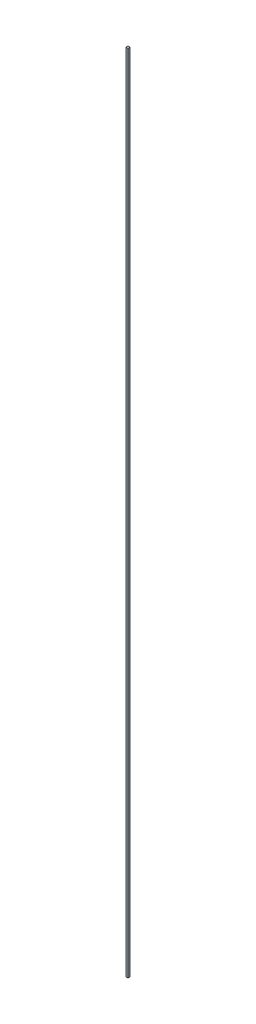
ISO-10303-21;
HEADER;
FILE_DESCRIPTION(('STEP AP214'),'2;1');
FILE_NAME('part.step','',(''),(''),'','','');
FILE_SCHEMA(('AUTOMOTIVE_DESIGN { 1 0 10303 214 1 1 1 1 }'));
ENDSEC;
DATA;
#1=APPLICATION_CONTEXT('core data for automotive mechanical design processes');
#2=APPLICATION_PROTOCOL_DEFINITION('international standard','automotive_design',2000,#1);
#3=PRODUCT_CONTEXT('',#1,'mechanical');
#4=PRODUCT('Part','Part','',(#3));
#5=PRODUCT_RELATED_PRODUCT_CATEGORY('part','',(#4));
#6=PRODUCT_DEFINITION_FORMATION('','',#4);
#7=PRODUCT_DEFINITION_CONTEXT('part definition',#1,'design');
#8=PRODUCT_DEFINITION('design','',#6,#7);
#9=PRODUCT_DEFINITION_SHAPE('','',#8);
#10=(LENGTH_UNIT() NAMED_UNIT(*) SI_UNIT(.MILLI.,.METRE.));
#11=(NAMED_UNIT(*) PLANE_ANGLE_UNIT() SI_UNIT($,.RADIAN.));
#12=(NAMED_UNIT(*) SI_UNIT($,.STERADIAN.) SOLID_ANGLE_UNIT());
#13=UNCERTAINTY_MEASURE_WITH_UNIT(LENGTH_MEASURE(1.E-05),#10,'distance_accuracy_value','');
#14=(GEOMETRIC_REPRESENTATION_CONTEXT(3) GLOBAL_UNCERTAINTY_ASSIGNED_CONTEXT((#13)) GLOBAL_UNIT_ASSIGNED_CONTEXT((#10,
#11,#12)) REPRESENTATION_CONTEXT('',''));
#15=CARTESIAN_POINT('',(0.,0.,0.));
#16=DIRECTION('',(0.,0.,1.));
#17=DIRECTION('',(1.,0.,0.));
#18=AXIS2_PLACEMENT_3D('',#15,#16,#17);
#19=CARTESIAN_POINT('',(1.5875,1219.2,1.5875));
#20=DIRECTION('',(-1.,0.,0.));
#21=DIRECTION('',(0.,0.,1.));
#22=AXIS2_PLACEMENT_3D('',#19,#20,#21);
#23=PLANE('',#22);
#24=DIRECTION('',(0.,0.,-1.));
#25=VECTOR('',#24,1.);
#26=CARTESIAN_POINT('',(1.5875,0.,1.5875));
#27=LINE('',#26,#25);
#28=CARTESIAN_POINT('',(1.5875,0.,1.5875));
#29=VERTEX_POINT('',#28);
#30=CARTESIAN_POINT('',(1.5875,0.,-1.5875));
#31=VERTEX_POINT('',#30);
#32=EDGE_CURVE('E81',#29,#31,#27,.T.);
#33=ORIENTED_EDGE('',*,*,#32,.T.);
#34=DIRECTION('',(0.,-1.,0.));
#35=VECTOR('',#34,1.);
#36=CARTESIAN_POINT('',(1.5875,1219.2,-1.5875));
#37=LINE('',#36,#35);
#38=CARTESIAN_POINT('',(1.5875,1219.2,-1.5875));
#39=VERTEX_POINT('',#38);
#40=EDGE_CURVE('E10',#39,#31,#37,.T.);
#41=ORIENTED_EDGE('',*,*,#40,.F.);
#42=DIRECTION('',(0.,0.,-1.));
#43=VECTOR('',#42,1.);
#44=CARTESIAN_POINT('',(1.5875,1219.2,1.5875));
#45=LINE('',#44,#43);
#46=CARTESIAN_POINT('',(1.5875,1219.2,1.5875));
#47=VERTEX_POINT('',#46);
#48=EDGE_CURVE('E67',#47,#39,#45,.T.);
#49=ORIENTED_EDGE('',*,*,#48,.F.);
#50=DIRECTION('',(0.,-1.,0.));
#51=VECTOR('',#50,1.);
#52=CARTESIAN_POINT('',(1.5875,1219.2,1.5875));
#53=LINE('',#52,#51);
#54=EDGE_CURVE('E75',#47,#29,#53,.T.);
#55=ORIENTED_EDGE('',*,*,#54,.T.);
#56=EDGE_LOOP('',(#33,#41,#49,#55));
#57=FACE_BOUND('',#56,.T.);
#58=ADVANCED_FACE('F16',(#57),#23,.F.);
#59=CARTESIAN_POINT('',(1.5875,1219.2,-1.5875));
#60=DIRECTION('',(0.,0.,1.));
#61=DIRECTION('',(1.,0.,0.));
#62=AXIS2_PLACEMENT_3D('',#59,#60,#61);
#63=PLANE('',#62);
#64=DIRECTION('',(-1.,0.,0.));
#65=VECTOR('',#64,1.);
#66=CARTESIAN_POINT('',(1.5875,0.,-1.5875));
#67=LINE('',#66,#65);
#68=CARTESIAN_POINT('',(-1.5875,0.,-1.5875));
#69=VERTEX_POINT('',#68);
#70=EDGE_CURVE('E71',#31,#69,#67,.T.);
#71=ORIENTED_EDGE('',*,*,#70,.T.);
#72=DIRECTION('',(0.,-1.,0.));
#73=VECTOR('',#72,1.);
#74=CARTESIAN_POINT('',(-1.5875,1219.2,-1.5875));
#75=LINE('',#74,#73);
#76=CARTESIAN_POINT('',(-1.5875,1219.2,-1.5875));
#77=VERTEX_POINT('',#76);
#78=EDGE_CURVE('E24',#77,#69,#75,.T.);
#79=ORIENTED_EDGE('',*,*,#78,.F.);
#80=DIRECTION('',(-1.,0.,0.));
#81=VECTOR('',#80,1.);
#82=CARTESIAN_POINT('',(1.5875,1219.2,-1.5875));
#83=LINE('',#82,#81);
#84=EDGE_CURVE('E62',#39,#77,#83,.T.);
#85=ORIENTED_EDGE('',*,*,#84,.F.);
#86=ORIENTED_EDGE('',*,*,#40,.T.);
#87=EDGE_LOOP('',(#71,#79,#85,#86));
#88=FACE_BOUND('',#87,.T.);
#89=ADVANCED_FACE('F70',(#88),#63,.F.);
#90=CARTESIAN_POINT('',(-1.5875,1219.2,-1.5875));
#91=DIRECTION('',(1.,0.,0.));
#92=DIRECTION('',(0.,0.,-1.));
#93=AXIS2_PLACEMENT_3D('',#90,#91,#92);
#94=PLANE('',#93);
#95=DIRECTION('',(0.,0.,1.));
#96=VECTOR('',#95,1.);
#97=CARTESIAN_POINT('',(-1.5875,0.,-1.5875));
#98=LINE('',#97,#96);
#99=CARTESIAN_POINT('',(-1.5875,0.,1.5875));
#100=VERTEX_POINT('',#99);
#101=EDGE_CURVE('E49',#69,#100,#98,.T.);
#102=ORIENTED_EDGE('',*,*,#101,.T.);
#103=DIRECTION('',(0.,-1.,0.));
#104=VECTOR('',#103,1.);
#105=CARTESIAN_POINT('',(-1.5875,1219.2,1.5875));
#106=LINE('',#105,#104);
#107=CARTESIAN_POINT('',(-1.5875,1219.2,1.5875));
#108=VERTEX_POINT('',#107);
#109=EDGE_CURVE('E72',#108,#100,#106,.T.);
#110=ORIENTED_EDGE('',*,*,#109,.F.);
#111=DIRECTION('',(0.,0.,1.));
#112=VECTOR('',#111,1.);
#113=CARTESIAN_POINT('',(-1.5875,1219.2,-1.5875));
#114=LINE('',#113,#112);
#115=EDGE_CURVE('E65',#77,#108,#114,.T.);
#116=ORIENTED_EDGE('',*,*,#115,.F.);
#117=ORIENTED_EDGE('',*,*,#78,.T.);
#118=EDGE_LOOP('',(#102,#110,#116,#117));
#119=FACE_BOUND('',#118,.T.);
#120=ADVANCED_FACE('F73',(#119),#94,.F.);
#121=CARTESIAN_POINT('',(-1.5875,1219.2,1.5875));
#122=DIRECTION('',(0.,0.,-1.));
#123=DIRECTION('',(-1.,0.,0.));
#124=AXIS2_PLACEMENT_3D('',#121,#122,#123);
#125=PLANE('',#124);
#126=DIRECTION('',(1.,0.,0.));
#127=VECTOR('',#126,1.);
#128=CARTESIAN_POINT('',(-1.5875,0.,1.5875));
#129=LINE('',#128,#127);
#130=EDGE_CURVE('E55',#100,#29,#129,.T.);
#131=ORIENTED_EDGE('',*,*,#130,.T.);
#132=ORIENTED_EDGE('',*,*,#54,.F.);
#133=DIRECTION('',(1.,0.,0.));
#134=VECTOR('',#133,1.);
#135=CARTESIAN_POINT('',(-1.5875,1219.2,1.5875));
#136=LINE('',#135,#134);
#137=EDGE_CURVE('E32',#108,#47,#136,.T.);
#138=ORIENTED_EDGE('',*,*,#137,.F.);
#139=ORIENTED_EDGE('',*,*,#109,.T.);
#140=EDGE_LOOP('',(#131,#132,#138,#139));
#141=FACE_BOUND('',#140,.T.);
#142=ADVANCED_FACE('F90',(#141),#125,.F.);
#143=CARTESIAN_POINT('',(0.,1219.2,0.));
#144=DIRECTION('',(0.,1.,0.));
#145=DIRECTION('',(0.,0.,1.));
#146=AXIS2_PLACEMENT_3D('',#143,#144,#145);
#147=PLANE('',#146);
#148=ORIENTED_EDGE('',*,*,#48,.T.);
#149=ORIENTED_EDGE('',*,*,#84,.T.);
#150=ORIENTED_EDGE('',*,*,#115,.T.);
#151=ORIENTED_EDGE('',*,*,#137,.T.);
#152=EDGE_LOOP('',(#148,#149,#150,#151));
#153=FACE_BOUND('',#152,.T.);
#154=ADVANCED_FACE('F63',(#153),#147,.T.);
#155=CARTESIAN_POINT('',(0.,0.,0.));
#156=DIRECTION('',(0.,1.,0.));
#157=DIRECTION('',(0.,0.,1.));
#158=AXIS2_PLACEMENT_3D('',#155,#156,#157);
#159=PLANE('',#158);
#160=ORIENTED_EDGE('',*,*,#32,.F.);
#161=ORIENTED_EDGE('',*,*,#130,.F.);
#162=ORIENTED_EDGE('',*,*,#101,.F.);
#163=ORIENTED_EDGE('',*,*,#70,.F.);
#164=EDGE_LOOP('',(#160,#161,#162,#163));
#165=FACE_BOUND('',#164,.T.);
#166=ADVANCED_FACE('F93',(#165),#159,.F.);
#167=CLOSED_SHELL('',(#58,#89,#120,#142,#154,#166));
#168=MANIFOLD_SOLID_BREP('B1',#167);
#169=ADVANCED_BREP_SHAPE_REPRESENTATION('',(#18,#168),#14);
#170=SHAPE_DEFINITION_REPRESENTATION(#9,#169);
ENDSEC;
END-ISO-10303-21;
